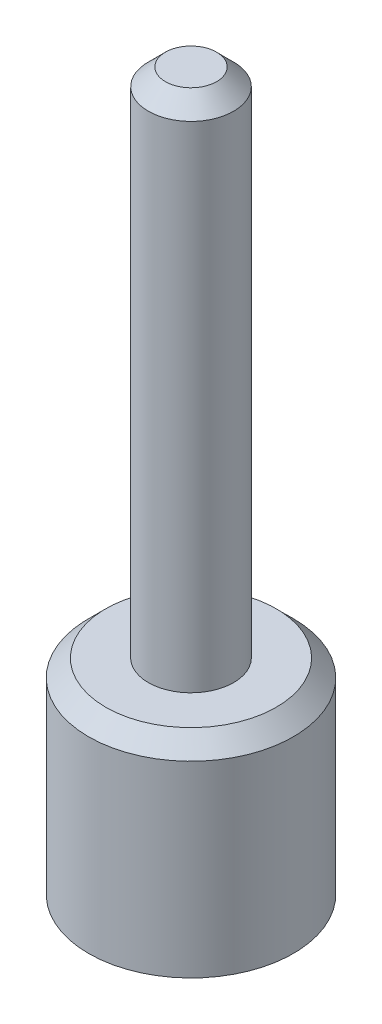
ISO-10303-21;
HEADER;
FILE_DESCRIPTION(('STEP AP214'),'2;1');
FILE_NAME('part.step','',(''),(''),'','','');
FILE_SCHEMA(('AUTOMOTIVE_DESIGN { 1 0 10303 214 1 1 1 1 }'));
ENDSEC;
DATA;
#1=APPLICATION_CONTEXT('core data for automotive mechanical design processes');
#2=APPLICATION_PROTOCOL_DEFINITION('international standard','automotive_design',2000,#1);
#3=PRODUCT_CONTEXT('',#1,'mechanical');
#4=PRODUCT('Part','Part','',(#3));
#5=PRODUCT_RELATED_PRODUCT_CATEGORY('part','',(#4));
#6=PRODUCT_DEFINITION_FORMATION('','',#4);
#7=PRODUCT_DEFINITION_CONTEXT('part definition',#1,'design');
#8=PRODUCT_DEFINITION('design','',#6,#7);
#9=PRODUCT_DEFINITION_SHAPE('','',#8);
#10=(LENGTH_UNIT() NAMED_UNIT(*) SI_UNIT(.MILLI.,.METRE.));
#11=(NAMED_UNIT(*) PLANE_ANGLE_UNIT() SI_UNIT($,.RADIAN.));
#12=(NAMED_UNIT(*) SI_UNIT($,.STERADIAN.) SOLID_ANGLE_UNIT());
#13=UNCERTAINTY_MEASURE_WITH_UNIT(LENGTH_MEASURE(1.E-05),#10,'distance_accuracy_value','');
#14=(GEOMETRIC_REPRESENTATION_CONTEXT(3) GLOBAL_UNCERTAINTY_ASSIGNED_CONTEXT((#13)) GLOBAL_UNIT_ASSIGNED_CONTEXT((#10,
#11,#12)) REPRESENTATION_CONTEXT('',''));
#15=CARTESIAN_POINT('',(0.,0.,0.));
#16=DIRECTION('',(0.,0.,1.));
#17=DIRECTION('',(1.,0.,0.));
#18=AXIS2_PLACEMENT_3D('',#15,#16,#17);
#19=CARTESIAN_POINT('',(0.,12.,0.));
#20=DIRECTION('',(0.,1.,0.));
#21=DIRECTION('',(0.,0.,1.));
#22=AXIS2_PLACEMENT_3D('',#19,#20,#21);
#23=PLANE('',#22);
#24=CARTESIAN_POINT('',(0.,12.,0.));
#25=DIRECTION('',(0.,1.,0.));
#26=DIRECTION('',(0.,0.,1.));
#27=AXIS2_PLACEMENT_3D('',#24,#25,#26);
#28=CIRCLE('',#27,5.);
#29=CARTESIAN_POINT('',(0.,12.,5.));
#30=VERTEX_POINT('',#29);
#31=EDGE_CURVE('E47',#30,#30,#28,.T.);
#32=ORIENTED_EDGE('',*,*,#31,.T.);
#33=EDGE_LOOP('',(#32));
#34=FACE_BOUND('',#33,.T.);
#35=CARTESIAN_POINT('',(0.,12.,0.));
#36=DIRECTION('',(0.,1.,0.));
#37=DIRECTION('',(0.,0.,1.));
#38=AXIS2_PLACEMENT_3D('',#35,#36,#37);
#39=CIRCLE('',#38,2.5);
#40=CARTESIAN_POINT('',(0.,12.,2.5));
#41=VERTEX_POINT('',#40);
#42=EDGE_CURVE('E55',#41,#41,#39,.T.);
#43=ORIENTED_EDGE('',*,*,#42,.F.);
#44=EDGE_LOOP('',(#43));
#45=FACE_BOUND('',#44,.T.);
#46=ADVANCED_FACE('F32',(#34,#45),#23,.T.);
#47=CARTESIAN_POINT('',(0.,12.,0.));
#48=DIRECTION('',(0.,-1.,0.));
#49=DIRECTION('',(0.,0.,-1.));
#50=AXIS2_PLACEMENT_3D('',#47,#48,#49);
#51=CYLINDRICAL_SURFACE('',#50,6.);
#52=CARTESIAN_POINT('',(0.,11.,0.));
#53=DIRECTION('',(0.,1.,0.));
#54=DIRECTION('',(0.,0.,1.));
#55=AXIS2_PLACEMENT_3D('',#52,#53,#54);
#56=CIRCLE('',#55,6.);
#57=CARTESIAN_POINT('',(0.,11.,6.));
#58=VERTEX_POINT('',#57);
#59=EDGE_CURVE('E43',#58,#58,#56,.F.);
#60=ORIENTED_EDGE('',*,*,#59,.T.);
#61=EDGE_LOOP('',(#60));
#62=FACE_BOUND('',#61,.T.);
#63=CARTESIAN_POINT('',(0.,0.,0.));
#64=DIRECTION('',(0.,1.,0.));
#65=DIRECTION('',(0.,0.,1.));
#66=AXIS2_PLACEMENT_3D('',#63,#64,#65);
#67=CIRCLE('',#66,6.);
#68=CARTESIAN_POINT('',(0.,0.,6.));
#69=VERTEX_POINT('',#68);
#70=EDGE_CURVE('E52',#69,#69,#67,.T.);
#71=ORIENTED_EDGE('',*,*,#70,.T.);
#72=EDGE_LOOP('',(#71));
#73=FACE_BOUND('',#72,.T.);
#74=ADVANCED_FACE('F62',(#62,#73),#51,.T.);
#75=CARTESIAN_POINT('',(0.,0.,0.));
#76=DIRECTION('',(0.,1.,0.));
#77=DIRECTION('',(0.,0.,1.));
#78=AXIS2_PLACEMENT_3D('',#75,#76,#77);
#79=PLANE('',#78);
#80=ORIENTED_EDGE('',*,*,#70,.F.);
#81=EDGE_LOOP('',(#80));
#82=FACE_BOUND('',#81,.T.);
#83=ADVANCED_FACE('F68',(#82),#79,.F.);
#84=CARTESIAN_POINT('',(0.,42.,0.));
#85=DIRECTION('',(0.,-1.,0.));
#86=DIRECTION('',(0.,0.,-1.));
#87=AXIS2_PLACEMENT_3D('',#84,#85,#86);
#88=CYLINDRICAL_SURFACE('',#87,2.5);
#89=CARTESIAN_POINT('',(0.,41.,0.));
#90=DIRECTION('',(0.,1.,0.));
#91=DIRECTION('',(0.,0.,1.));
#92=AXIS2_PLACEMENT_3D('',#89,#90,#91);
#93=CIRCLE('',#92,2.5);
#94=CARTESIAN_POINT('',(0.,41.,2.5));
#95=VERTEX_POINT('',#94);
#96=EDGE_CURVE('E10',#95,#95,#93,.F.);
#97=ORIENTED_EDGE('',*,*,#96,.T.);
#98=EDGE_LOOP('',(#97));
#99=FACE_BOUND('',#98,.T.);
#100=ORIENTED_EDGE('',*,*,#42,.T.);
#101=EDGE_LOOP('',(#100));
#102=FACE_BOUND('',#101,.T.);
#103=ADVANCED_FACE('F59',(#99,#102),#88,.T.);
#104=CARTESIAN_POINT('',(0.,42.,0.));
#105=DIRECTION('',(0.,1.,0.));
#106=DIRECTION('',(0.,0.,1.));
#107=AXIS2_PLACEMENT_3D('',#104,#105,#106);
#108=PLANE('',#107);
#109=CARTESIAN_POINT('',(0.,42.,0.));
#110=DIRECTION('',(0.,1.,0.));
#111=DIRECTION('',(0.,0.,1.));
#112=AXIS2_PLACEMENT_3D('',#109,#110,#111);
#113=CIRCLE('',#112,1.5);
#114=CARTESIAN_POINT('',(0.,42.,1.5));
#115=VERTEX_POINT('',#114);
#116=EDGE_CURVE('E39',#115,#115,#113,.T.);
#117=ORIENTED_EDGE('',*,*,#116,.T.);
#118=EDGE_LOOP('',(#117));
#119=FACE_BOUND('',#118,.T.);
#120=ADVANCED_FACE('F78',(#119),#108,.T.);
#121=CARTESIAN_POINT('',(0.,12.,0.));
#122=DIRECTION('',(0.,-1.,0.));
#123=DIRECTION('',(0.,0.,-1.));
#124=AXIS2_PLACEMENT_3D('',#121,#122,#123);
#125=CONICAL_SURFACE('',#124,5.,0.785398163397445);
#126=ORIENTED_EDGE('',*,*,#59,.F.);
#127=EDGE_LOOP('',(#126));
#128=FACE_BOUND('',#127,.T.);
#129=ORIENTED_EDGE('',*,*,#31,.F.);
#130=EDGE_LOOP('',(#129));
#131=FACE_BOUND('',#130,.T.);
#132=ADVANCED_FACE('F76',(#128,#131),#125,.T.);
#133=CARTESIAN_POINT('',(0.,42.,0.));
#134=DIRECTION('',(0.,-1.,0.));
#135=DIRECTION('',(0.,0.,-1.));
#136=AXIS2_PLACEMENT_3D('',#133,#134,#135);
#137=CONICAL_SURFACE('',#136,1.5,0.785398163397444);
#138=ORIENTED_EDGE('',*,*,#96,.F.);
#139=EDGE_LOOP('',(#138));
#140=FACE_BOUND('',#139,.T.);
#141=ORIENTED_EDGE('',*,*,#116,.F.);
#142=EDGE_LOOP('',(#141));
#143=FACE_BOUND('',#142,.T.);
#144=ADVANCED_FACE('F34',(#140,#143),#137,.T.);
#145=CLOSED_SHELL('',(#46,#74,#83,#103,#120,#132,#144));
#146=MANIFOLD_SOLID_BREP('B2',#145);
#147=ADVANCED_BREP_SHAPE_REPRESENTATION('',(#18,#146),#14);
#148=SHAPE_DEFINITION_REPRESENTATION(#9,#147);
ENDSEC;
END-ISO-10303-21;
